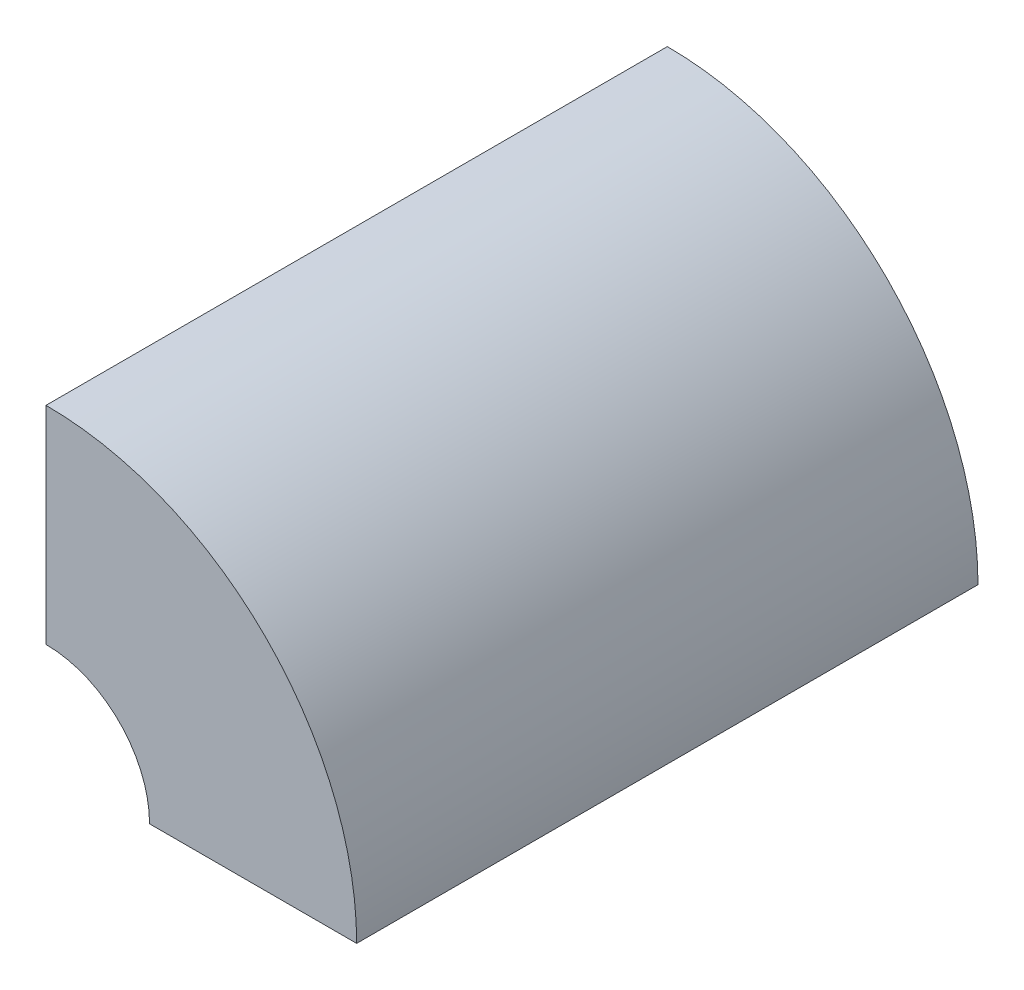
ISO-10303-21;
HEADER;
FILE_DESCRIPTION(('STEP AP214'),'2;1');
FILE_NAME('part.step','',(''),(''),'','','');
FILE_SCHEMA(('AUTOMOTIVE_DESIGN { 1 0 10303 214 1 1 1 1 }'));
ENDSEC;
DATA;
#1=APPLICATION_CONTEXT('core data for automotive mechanical design processes');
#2=APPLICATION_PROTOCOL_DEFINITION('international standard','automotive_design',2000,#1);
#3=PRODUCT_CONTEXT('',#1,'mechanical');
#4=PRODUCT('Part','Part','',(#3));
#5=PRODUCT_RELATED_PRODUCT_CATEGORY('part','',(#4));
#6=PRODUCT_DEFINITION_FORMATION('','',#4);
#7=PRODUCT_DEFINITION_CONTEXT('part definition',#1,'design');
#8=PRODUCT_DEFINITION('design','',#6,#7);
#9=PRODUCT_DEFINITION_SHAPE('','',#8);
#10=(LENGTH_UNIT() NAMED_UNIT(*) SI_UNIT(.MILLI.,.METRE.));
#11=(NAMED_UNIT(*) PLANE_ANGLE_UNIT() SI_UNIT($,.RADIAN.));
#12=(NAMED_UNIT(*) SI_UNIT($,.STERADIAN.) SOLID_ANGLE_UNIT());
#13=UNCERTAINTY_MEASURE_WITH_UNIT(LENGTH_MEASURE(1.E-05),#10,'distance_accuracy_value','');
#14=(GEOMETRIC_REPRESENTATION_CONTEXT(3) GLOBAL_UNCERTAINTY_ASSIGNED_CONTEXT((#13)) GLOBAL_UNIT_ASSIGNED_CONTEXT((#10,
#11,#12)) REPRESENTATION_CONTEXT('',''));
#15=CARTESIAN_POINT('',(0.,0.,0.));
#16=DIRECTION('',(0.,0.,1.));
#17=DIRECTION('',(1.,0.,0.));
#18=AXIS2_PLACEMENT_3D('',#15,#16,#17);
#19=CARTESIAN_POINT('',(0.,0.,0.));
#20=DIRECTION('',(0.,0.,-1.));
#21=DIRECTION('',(-1.,0.,0.));
#22=AXIS2_PLACEMENT_3D('',#19,#20,#21);
#23=CYLINDRICAL_SURFACE('',#22,2.);
#24=CARTESIAN_POINT('',(0.,0.,12.));
#25=DIRECTION('',(0.,0.,-1.));
#26=DIRECTION('',(-1.,0.,0.));
#27=AXIS2_PLACEMENT_3D('',#24,#25,#26);
#28=CIRCLE('',#27,2.);
#29=CARTESIAN_POINT('',(0.,2.,12.));
#30=VERTEX_POINT('',#29);
#31=CARTESIAN_POINT('',(2.,0.,12.));
#32=VERTEX_POINT('',#31);
#33=EDGE_CURVE('E11',#30,#32,#28,.T.);
#34=ORIENTED_EDGE('',*,*,#33,.F.);
#35=DIRECTION('',(0.,0.,1.));
#36=VECTOR('',#35,1.);
#37=CARTESIAN_POINT('',(0.,2.,0.));
#38=LINE('',#37,#36);
#39=CARTESIAN_POINT('',(0.,2.,0.));
#40=VERTEX_POINT('',#39);
#41=EDGE_CURVE('E104',#40,#30,#38,.T.);
#42=ORIENTED_EDGE('',*,*,#41,.F.);
#43=CARTESIAN_POINT('',(0.,0.,0.));
#44=DIRECTION('',(0.,0.,-1.));
#45=DIRECTION('',(-1.,0.,0.));
#46=AXIS2_PLACEMENT_3D('',#43,#44,#45);
#47=CIRCLE('',#46,2.);
#48=CARTESIAN_POINT('',(2.,0.,0.));
#49=VERTEX_POINT('',#48);
#50=EDGE_CURVE('E59',#40,#49,#47,.T.);
#51=ORIENTED_EDGE('',*,*,#50,.T.);
#52=DIRECTION('',(0.,0.,1.));
#53=VECTOR('',#52,1.);
#54=CARTESIAN_POINT('',(2.,0.,0.));
#55=LINE('',#54,#53);
#56=EDGE_CURVE('E94',#49,#32,#55,.T.);
#57=ORIENTED_EDGE('',*,*,#56,.T.);
#58=EDGE_LOOP('',(#34,#42,#51,#57));
#59=FACE_BOUND('',#58,.T.);
#60=ADVANCED_FACE('F43',(#59),#23,.F.);
#61=CARTESIAN_POINT('',(0.,2.,12.));
#62=DIRECTION('',(0.,0.,-1.));
#63=DIRECTION('',(-1.,0.,0.));
#64=AXIS2_PLACEMENT_3D('',#61,#62,#63);
#65=PLANE('',#64);
#66=CARTESIAN_POINT('',(0.,0.,12.));
#67=DIRECTION('',(0.,0.,-1.));
#68=DIRECTION('',(-1.,0.,0.));
#69=AXIS2_PLACEMENT_3D('',#66,#67,#68);
#70=CIRCLE('',#69,6.);
#71=CARTESIAN_POINT('',(0.,6.,12.));
#72=VERTEX_POINT('',#71);
#73=CARTESIAN_POINT('',(6.,0.,12.));
#74=VERTEX_POINT('',#73);
#75=EDGE_CURVE('E51',#72,#74,#70,.T.);
#76=ORIENTED_EDGE('',*,*,#75,.F.);
#77=DIRECTION('',(0.,1.,0.));
#78=VECTOR('',#77,1.);
#79=CARTESIAN_POINT('',(0.,2.,12.));
#80=LINE('',#79,#78);
#81=EDGE_CURVE('E89',#30,#72,#80,.T.);
#82=ORIENTED_EDGE('',*,*,#81,.F.);
#83=ORIENTED_EDGE('',*,*,#33,.T.);
#84=DIRECTION('',(1.,0.,0.));
#85=VECTOR('',#84,1.);
#86=CARTESIAN_POINT('',(2.,0.,12.));
#87=LINE('',#86,#85);
#88=EDGE_CURVE('E87',#32,#74,#87,.T.);
#89=ORIENTED_EDGE('',*,*,#88,.T.);
#90=EDGE_LOOP('',(#76,#82,#83,#89));
#91=FACE_BOUND('',#90,.T.);
#92=ADVANCED_FACE('F44',(#91),#65,.F.);
#93=CARTESIAN_POINT('',(0.,0.,0.));
#94=DIRECTION('',(0.,0.,-1.));
#95=DIRECTION('',(-1.,0.,0.));
#96=AXIS2_PLACEMENT_3D('',#93,#94,#95);
#97=CYLINDRICAL_SURFACE('',#96,6.);
#98=CARTESIAN_POINT('',(0.,0.,0.));
#99=DIRECTION('',(0.,0.,-1.));
#100=DIRECTION('',(-1.,0.,0.));
#101=AXIS2_PLACEMENT_3D('',#98,#99,#100);
#102=CIRCLE('',#101,6.);
#103=CARTESIAN_POINT('',(0.,6.,0.));
#104=VERTEX_POINT('',#103);
#105=CARTESIAN_POINT('',(6.,0.,0.));
#106=VERTEX_POINT('',#105);
#107=EDGE_CURVE('E66',#104,#106,#102,.T.);
#108=ORIENTED_EDGE('',*,*,#107,.F.);
#109=DIRECTION('',(0.,0.,-1.));
#110=VECTOR('',#109,1.);
#111=CARTESIAN_POINT('',(0.,6.,0.));
#112=LINE('',#111,#110);
#113=EDGE_CURVE('E107',#72,#104,#112,.T.);
#114=ORIENTED_EDGE('',*,*,#113,.F.);
#115=ORIENTED_EDGE('',*,*,#75,.T.);
#116=DIRECTION('',(0.,0.,-1.));
#117=VECTOR('',#116,1.);
#118=CARTESIAN_POINT('',(6.,0.,0.));
#119=LINE('',#118,#117);
#120=EDGE_CURVE('E97',#74,#106,#119,.T.);
#121=ORIENTED_EDGE('',*,*,#120,.T.);
#122=EDGE_LOOP('',(#108,#114,#115,#121));
#123=FACE_BOUND('',#122,.T.);
#124=ADVANCED_FACE('F111',(#123),#97,.T.);
#125=CARTESIAN_POINT('',(0.,2.,0.));
#126=DIRECTION('',(0.,0.,1.));
#127=DIRECTION('',(1.,0.,0.));
#128=AXIS2_PLACEMENT_3D('',#125,#126,#127);
#129=PLANE('',#128);
#130=DIRECTION('',(0.,-1.,0.));
#131=VECTOR('',#130,1.);
#132=CARTESIAN_POINT('',(0.,2.,0.));
#133=LINE('',#132,#131);
#134=EDGE_CURVE('E109',#104,#40,#133,.T.);
#135=ORIENTED_EDGE('',*,*,#134,.F.);
#136=ORIENTED_EDGE('',*,*,#107,.T.);
#137=DIRECTION('',(-1.,0.,0.));
#138=VECTOR('',#137,1.);
#139=CARTESIAN_POINT('',(2.,0.,0.));
#140=LINE('',#139,#138);
#141=EDGE_CURVE('E101',#106,#49,#140,.T.);
#142=ORIENTED_EDGE('',*,*,#141,.T.);
#143=ORIENTED_EDGE('',*,*,#50,.F.);
#144=EDGE_LOOP('',(#135,#136,#142,#143));
#145=FACE_BOUND('',#144,.T.);
#146=ADVANCED_FACE('F116',(#145),#129,.F.);
#147=CARTESIAN_POINT('',(0.,0.,0.));
#148=DIRECTION('',(-1.,0.,0.));
#149=DIRECTION('',(0.,0.,1.));
#150=AXIS2_PLACEMENT_3D('',#147,#148,#149);
#151=PLANE('',#150);
#152=ORIENTED_EDGE('',*,*,#41,.T.);
#153=ORIENTED_EDGE('',*,*,#81,.T.);
#154=ORIENTED_EDGE('',*,*,#113,.T.);
#155=ORIENTED_EDGE('',*,*,#134,.T.);
#156=EDGE_LOOP('',(#152,#153,#154,#155));
#157=FACE_BOUND('',#156,.T.);
#158=ADVANCED_FACE('F119',(#157),#151,.T.);
#159=CARTESIAN_POINT('',(0.,0.,0.));
#160=DIRECTION('',(0.,1.,0.));
#161=DIRECTION('',(0.,0.,1.));
#162=AXIS2_PLACEMENT_3D('',#159,#160,#161);
#163=PLANE('',#162);
#164=ORIENTED_EDGE('',*,*,#56,.F.);
#165=ORIENTED_EDGE('',*,*,#141,.F.);
#166=ORIENTED_EDGE('',*,*,#120,.F.);
#167=ORIENTED_EDGE('',*,*,#88,.F.);
#168=EDGE_LOOP('',(#164,#165,#166,#167));
#169=FACE_BOUND('',#168,.T.);
#170=ADVANCED_FACE('F98',(#169),#163,.F.);
#171=CLOSED_SHELL('',(#60,#92,#124,#146,#158,#170));
#172=MANIFOLD_SOLID_BREP('B2',#171);
#173=ADVANCED_BREP_SHAPE_REPRESENTATION('',(#18,#172),#14);
#174=SHAPE_DEFINITION_REPRESENTATION(#9,#173);
ENDSEC;
END-ISO-10303-21;
